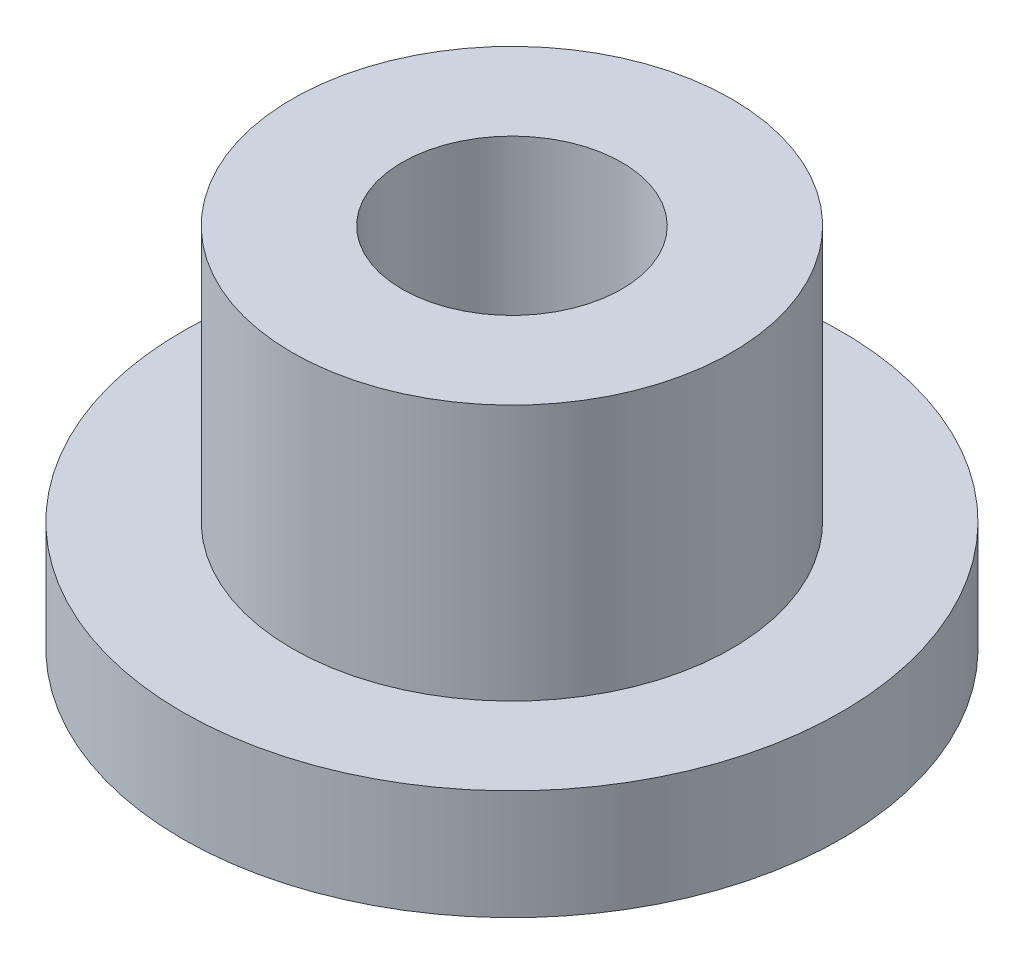
ISO-10303-21;
HEADER;
FILE_DESCRIPTION(('STEP AP214'),'2;1');
FILE_NAME('part.step','',(''),(''),'','','');
FILE_SCHEMA(('AUTOMOTIVE_DESIGN { 1 0 10303 214 1 1 1 1 }'));
ENDSEC;
DATA;
#1=APPLICATION_CONTEXT('core data for automotive mechanical design processes');
#2=APPLICATION_PROTOCOL_DEFINITION('international standard','automotive_design',2000,#1);
#3=PRODUCT_CONTEXT('',#1,'mechanical');
#4=PRODUCT('Part','Part','',(#3));
#5=PRODUCT_RELATED_PRODUCT_CATEGORY('part','',(#4));
#6=PRODUCT_DEFINITION_FORMATION('','',#4);
#7=PRODUCT_DEFINITION_CONTEXT('part definition',#1,'design');
#8=PRODUCT_DEFINITION('design','',#6,#7);
#9=PRODUCT_DEFINITION_SHAPE('','',#8);
#10=(LENGTH_UNIT() NAMED_UNIT(*) SI_UNIT(.MILLI.,.METRE.));
#11=(NAMED_UNIT(*) PLANE_ANGLE_UNIT() SI_UNIT($,.RADIAN.));
#12=(NAMED_UNIT(*) SI_UNIT($,.STERADIAN.) SOLID_ANGLE_UNIT());
#13=UNCERTAINTY_MEASURE_WITH_UNIT(LENGTH_MEASURE(1.E-05),#10,'distance_accuracy_value','');
#14=(GEOMETRIC_REPRESENTATION_CONTEXT(3) GLOBAL_UNCERTAINTY_ASSIGNED_CONTEXT((#13)) GLOBAL_UNIT_ASSIGNED_CONTEXT((#10,
#11,#12)) REPRESENTATION_CONTEXT('',''));
#15=CARTESIAN_POINT('',(0.,0.,0.));
#16=DIRECTION('',(0.,0.,1.));
#17=DIRECTION('',(1.,0.,0.));
#18=AXIS2_PLACEMENT_3D('',#15,#16,#17);
#19=CARTESIAN_POINT('',(0.,1.5,0.));
#20=DIRECTION('',(0.,1.,0.));
#21=DIRECTION('',(0.,0.,1.));
#22=AXIS2_PLACEMENT_3D('',#19,#20,#21);
#23=PLANE('',#22);
#24=CARTESIAN_POINT('',(0.,1.5,0.));
#25=DIRECTION('',(0.,1.,0.));
#26=DIRECTION('',(0.,0.,1.));
#27=AXIS2_PLACEMENT_3D('',#24,#25,#26);
#28=CIRCLE('',#27,4.5);
#29=CARTESIAN_POINT('',(0.,1.5,4.5));
#30=VERTEX_POINT('',#29);
#31=EDGE_CURVE('E10',#30,#30,#28,.T.);
#32=ORIENTED_EDGE('',*,*,#31,.T.);
#33=EDGE_LOOP('',(#32));
#34=FACE_BOUND('',#33,.T.);
#35=CARTESIAN_POINT('',(0.,1.5,0.));
#36=DIRECTION('',(0.,1.,0.));
#37=DIRECTION('',(0.,0.,1.));
#38=AXIS2_PLACEMENT_3D('',#35,#36,#37);
#39=CIRCLE('',#38,3.);
#40=CARTESIAN_POINT('',(0.,1.5,3.));
#41=VERTEX_POINT('',#40);
#42=EDGE_CURVE('E50',#41,#41,#39,.T.);
#43=ORIENTED_EDGE('',*,*,#42,.F.);
#44=EDGE_LOOP('',(#43));
#45=FACE_BOUND('',#44,.T.);
#46=ADVANCED_FACE('F34',(#34,#45),#23,.T.);
#47=CARTESIAN_POINT('',(0.,0.,0.));
#48=DIRECTION('',(0.,1.,0.));
#49=DIRECTION('',(0.,0.,1.));
#50=AXIS2_PLACEMENT_3D('',#47,#48,#49);
#51=PLANE('',#50);
#52=CARTESIAN_POINT('',(0.,0.,0.));
#53=DIRECTION('',(0.,1.,0.));
#54=DIRECTION('',(0.,0.,1.));
#55=AXIS2_PLACEMENT_3D('',#52,#53,#54);
#56=CIRCLE('',#55,4.5);
#57=CARTESIAN_POINT('',(0.,0.,4.5));
#58=VERTEX_POINT('',#57);
#59=EDGE_CURVE('E38',#58,#58,#56,.T.);
#60=ORIENTED_EDGE('',*,*,#59,.F.);
#61=EDGE_LOOP('',(#60));
#62=FACE_BOUND('',#61,.T.);
#63=CARTESIAN_POINT('',(0.,0.,0.));
#64=DIRECTION('',(0.,1.,0.));
#65=DIRECTION('',(0.,0.,1.));
#66=AXIS2_PLACEMENT_3D('',#63,#64,#65);
#67=CIRCLE('',#66,1.5);
#68=CARTESIAN_POINT('',(0.,0.,1.5));
#69=VERTEX_POINT('',#68);
#70=EDGE_CURVE('E45',#69,#69,#67,.T.);
#71=ORIENTED_EDGE('',*,*,#70,.T.);
#72=EDGE_LOOP('',(#71));
#73=FACE_BOUND('',#72,.T.);
#74=ADVANCED_FACE('F75',(#62,#73),#51,.F.);
#75=CARTESIAN_POINT('',(0.,1.5,0.));
#76=DIRECTION('',(0.,-1.,0.));
#77=DIRECTION('',(0.,0.,-1.));
#78=AXIS2_PLACEMENT_3D('',#75,#76,#77);
#79=CYLINDRICAL_SURFACE('',#78,4.5);
#80=ORIENTED_EDGE('',*,*,#31,.F.);
#81=EDGE_LOOP('',(#80));
#82=FACE_BOUND('',#81,.T.);
#83=ORIENTED_EDGE('',*,*,#59,.T.);
#84=EDGE_LOOP('',(#83));
#85=FACE_BOUND('',#84,.T.);
#86=ADVANCED_FACE('F36',(#82,#85),#79,.T.);
#87=CARTESIAN_POINT('',(0.,1.5,0.));
#88=DIRECTION('',(0.,-1.,0.));
#89=DIRECTION('',(0.,0.,-1.));
#90=AXIS2_PLACEMENT_3D('',#87,#88,#89);
#91=CYLINDRICAL_SURFACE('',#90,1.5);
#92=ORIENTED_EDGE('',*,*,#70,.F.);
#93=EDGE_LOOP('',(#92));
#94=FACE_BOUND('',#93,.T.);
#95=CARTESIAN_POINT('',(0.,5.,0.));
#96=DIRECTION('',(0.,1.,0.));
#97=DIRECTION('',(0.,0.,1.));
#98=AXIS2_PLACEMENT_3D('',#95,#96,#97);
#99=CIRCLE('',#98,1.5);
#100=CARTESIAN_POINT('',(0.,5.,1.5));
#101=VERTEX_POINT('',#100);
#102=EDGE_CURVE('E53',#101,#101,#99,.T.);
#103=ORIENTED_EDGE('',*,*,#102,.T.);
#104=EDGE_LOOP('',(#103));
#105=FACE_BOUND('',#104,.T.);
#106=ADVANCED_FACE('F59',(#94,#105),#91,.F.);
#107=CARTESIAN_POINT('',(0.,5.,0.));
#108=DIRECTION('',(0.,1.,0.));
#109=DIRECTION('',(0.,0.,1.));
#110=AXIS2_PLACEMENT_3D('',#107,#108,#109);
#111=PLANE('',#110);
#112=CARTESIAN_POINT('',(0.,5.,0.));
#113=DIRECTION('',(0.,1.,0.));
#114=DIRECTION('',(0.,0.,1.));
#115=AXIS2_PLACEMENT_3D('',#112,#113,#114);
#116=CIRCLE('',#115,3.);
#117=CARTESIAN_POINT('',(0.,5.,3.));
#118=VERTEX_POINT('',#117);
#119=EDGE_CURVE('E49',#118,#118,#116,.T.);
#120=ORIENTED_EDGE('',*,*,#119,.T.);
#121=EDGE_LOOP('',(#120));
#122=FACE_BOUND('',#121,.T.);
#123=ORIENTED_EDGE('',*,*,#102,.F.);
#124=EDGE_LOOP('',(#123));
#125=FACE_BOUND('',#124,.T.);
#126=ADVANCED_FACE('F61',(#122,#125),#111,.T.);
#127=CARTESIAN_POINT('',(0.,5.,0.));
#128=DIRECTION('',(0.,-1.,0.));
#129=DIRECTION('',(0.,0.,-1.));
#130=AXIS2_PLACEMENT_3D('',#127,#128,#129);
#131=CYLINDRICAL_SURFACE('',#130,3.);
#132=ORIENTED_EDGE('',*,*,#119,.F.);
#133=EDGE_LOOP('',(#132));
#134=FACE_BOUND('',#133,.T.);
#135=ORIENTED_EDGE('',*,*,#42,.T.);
#136=EDGE_LOOP('',(#135));
#137=FACE_BOUND('',#136,.T.);
#138=ADVANCED_FACE('F63',(#134,#137),#131,.T.);
#139=CLOSED_SHELL('',(#46,#74,#86,#106,#126,#138));
#140=MANIFOLD_SOLID_BREP('B2',#139);
#141=ADVANCED_BREP_SHAPE_REPRESENTATION('',(#18,#140),#14);
#142=SHAPE_DEFINITION_REPRESENTATION(#9,#141);
ENDSEC;
END-ISO-10303-21;
